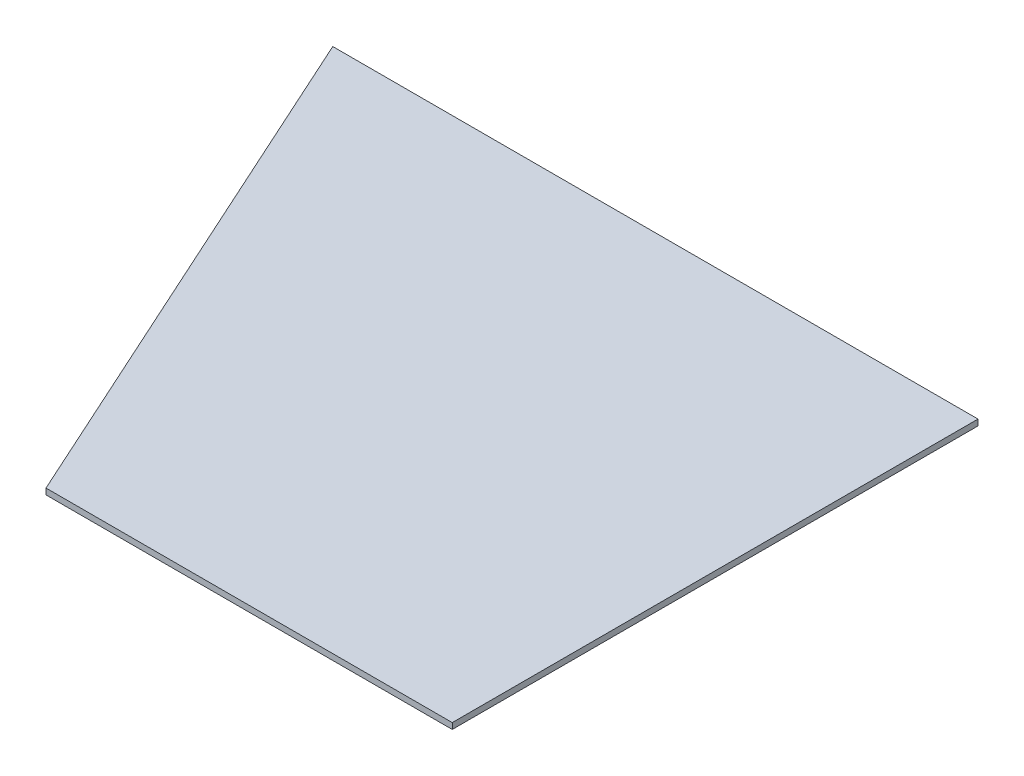
ISO-10303-21;
HEADER;
FILE_DESCRIPTION(('STEP AP214'),'2;1');
FILE_NAME('part.step','',(''),(''),'','','');
FILE_SCHEMA(('AUTOMOTIVE_DESIGN { 1 0 10303 214 1 1 1 1 }'));
ENDSEC;
DATA;
#1=APPLICATION_CONTEXT('core data for automotive mechanical design processes');
#2=APPLICATION_PROTOCOL_DEFINITION('international standard','automotive_design',2000,#1);
#3=PRODUCT_CONTEXT('',#1,'mechanical');
#4=PRODUCT('Part','Part','',(#3));
#5=PRODUCT_RELATED_PRODUCT_CATEGORY('part','',(#4));
#6=PRODUCT_DEFINITION_FORMATION('','',#4);
#7=PRODUCT_DEFINITION_CONTEXT('part definition',#1,'design');
#8=PRODUCT_DEFINITION('design','',#6,#7);
#9=PRODUCT_DEFINITION_SHAPE('','',#8);
#10=(LENGTH_UNIT() NAMED_UNIT(*) SI_UNIT(.MILLI.,.METRE.));
#11=(NAMED_UNIT(*) PLANE_ANGLE_UNIT() SI_UNIT($,.RADIAN.));
#12=(NAMED_UNIT(*) SI_UNIT($,.STERADIAN.) SOLID_ANGLE_UNIT());
#13=UNCERTAINTY_MEASURE_WITH_UNIT(LENGTH_MEASURE(1.E-05),#10,'distance_accuracy_value','');
#14=(GEOMETRIC_REPRESENTATION_CONTEXT(3) GLOBAL_UNCERTAINTY_ASSIGNED_CONTEXT((#13)) GLOBAL_UNIT_ASSIGNED_CONTEXT((#10,
#11,#12)) REPRESENTATION_CONTEXT('',''));
#15=CARTESIAN_POINT('',(0.,0.,0.));
#16=DIRECTION('',(0.,0.,1.));
#17=DIRECTION('',(1.,0.,0.));
#18=AXIS2_PLACEMENT_3D('',#15,#16,#17);
#19=CARTESIAN_POINT('',(580.,1.,176.));
#20=DIRECTION('',(0.910366477462605,0.,-0.413802944301184));
#21=DIRECTION('',(-0.413802944301184,0.,-0.910366477462605));
#22=AXIS2_PLACEMENT_3D('',#19,#20,#21);
#23=PLANE('',#22);
#24=DIRECTION('',(0.413802944301184,0.,0.910366477462605));
#25=VECTOR('',#24,1.);
#26=CARTESIAN_POINT('',(580.,-1.,176.));
#27=LINE('',#26,#25);
#28=CARTESIAN_POINT('',(500.,-1.,0.));
#29=VERTEX_POINT('',#28);
#30=CARTESIAN_POINT('',(580.,-1.,176.));
#31=VERTEX_POINT('',#30);
#32=EDGE_CURVE('E107',#29,#31,#27,.T.);
#33=ORIENTED_EDGE('',*,*,#32,.T.);
#34=DIRECTION('',(0.,-1.,0.));
#35=VECTOR('',#34,1.);
#36=CARTESIAN_POINT('',(580.,1.,176.));
#37=LINE('',#36,#35);
#38=CARTESIAN_POINT('',(580.,1.,176.));
#39=VERTEX_POINT('',#38);
#40=EDGE_CURVE('E11',#39,#31,#37,.T.);
#41=ORIENTED_EDGE('',*,*,#40,.F.);
#42=DIRECTION('',(0.413802944301184,0.,0.910366477462605));
#43=VECTOR('',#42,1.);
#44=CARTESIAN_POINT('',(580.,1.,176.));
#45=LINE('',#44,#43);
#46=CARTESIAN_POINT('',(500.,1.,0.));
#47=VERTEX_POINT('',#46);
#48=EDGE_CURVE('E91',#47,#39,#45,.T.);
#49=ORIENTED_EDGE('',*,*,#48,.F.);
#50=DIRECTION('',(0.,-1.,0.));
#51=VECTOR('',#50,1.);
#52=CARTESIAN_POINT('',(500.,1.,0.));
#53=LINE('',#52,#51);
#54=EDGE_CURVE('E103',#47,#29,#53,.T.);
#55=ORIENTED_EDGE('',*,*,#54,.T.);
#56=EDGE_LOOP('',(#33,#41,#49,#55));
#57=FACE_BOUND('',#56,.T.);
#58=ADVANCED_FACE('F39',(#57),#23,.F.);
#59=CARTESIAN_POINT('',(716.,1.,176.));
#60=DIRECTION('',(0.,0.,-1.));
#61=DIRECTION('',(-1.,0.,0.));
#62=AXIS2_PLACEMENT_3D('',#59,#60,#61);
#63=PLANE('',#62);
#64=DIRECTION('',(1.,0.,0.));
#65=VECTOR('',#64,1.);
#66=CARTESIAN_POINT('',(716.,-1.,176.));
#67=LINE('',#66,#65);
#68=CARTESIAN_POINT('',(716.,-1.,176.));
#69=VERTEX_POINT('',#68);
#70=EDGE_CURVE('E96',#31,#69,#67,.T.);
#71=ORIENTED_EDGE('',*,*,#70,.T.);
#72=DIRECTION('',(0.,-1.,0.));
#73=VECTOR('',#72,1.);
#74=CARTESIAN_POINT('',(716.,1.,176.));
#75=LINE('',#74,#73);
#76=CARTESIAN_POINT('',(716.,1.,176.));
#77=VERTEX_POINT('',#76);
#78=EDGE_CURVE('E48',#77,#69,#75,.T.);
#79=ORIENTED_EDGE('',*,*,#78,.F.);
#80=DIRECTION('',(1.,0.,0.));
#81=VECTOR('',#80,1.);
#82=CARTESIAN_POINT('',(716.,1.,176.));
#83=LINE('',#82,#81);
#84=EDGE_CURVE('E86',#39,#77,#83,.T.);
#85=ORIENTED_EDGE('',*,*,#84,.F.);
#86=ORIENTED_EDGE('',*,*,#40,.T.);
#87=EDGE_LOOP('',(#71,#79,#85,#86));
#88=FACE_BOUND('',#87,.T.);
#89=ADVANCED_FACE('F95',(#88),#63,.F.);
#90=CARTESIAN_POINT('',(716.,1.,0.));
#91=DIRECTION('',(-1.,0.,0.));
#92=DIRECTION('',(0.,0.,1.));
#93=AXIS2_PLACEMENT_3D('',#90,#91,#92);
#94=PLANE('',#93);
#95=DIRECTION('',(0.,0.,-1.));
#96=VECTOR('',#95,1.);
#97=CARTESIAN_POINT('',(716.,-1.,0.));
#98=LINE('',#97,#96);
#99=CARTESIAN_POINT('',(716.,-1.,0.));
#100=VERTEX_POINT('',#99);
#101=EDGE_CURVE('E73',#69,#100,#98,.T.);
#102=ORIENTED_EDGE('',*,*,#101,.T.);
#103=DIRECTION('',(0.,-1.,0.));
#104=VECTOR('',#103,1.);
#105=CARTESIAN_POINT('',(716.,1.,0.));
#106=LINE('',#105,#104);
#107=CARTESIAN_POINT('',(716.,1.,0.));
#108=VERTEX_POINT('',#107);
#109=EDGE_CURVE('E98',#108,#100,#106,.T.);
#110=ORIENTED_EDGE('',*,*,#109,.F.);
#111=DIRECTION('',(0.,0.,-1.));
#112=VECTOR('',#111,1.);
#113=CARTESIAN_POINT('',(716.,1.,0.));
#114=LINE('',#113,#112);
#115=EDGE_CURVE('E89',#77,#108,#114,.T.);
#116=ORIENTED_EDGE('',*,*,#115,.F.);
#117=ORIENTED_EDGE('',*,*,#78,.T.);
#118=EDGE_LOOP('',(#102,#110,#116,#117));
#119=FACE_BOUND('',#118,.T.);
#120=ADVANCED_FACE('F99',(#119),#94,.F.);
#121=CARTESIAN_POINT('',(500.,1.,0.));
#122=DIRECTION('',(0.,0.,1.));
#123=DIRECTION('',(1.,0.,0.));
#124=AXIS2_PLACEMENT_3D('',#121,#122,#123);
#125=PLANE('',#124);
#126=DIRECTION('',(-1.,0.,0.));
#127=VECTOR('',#126,1.);
#128=CARTESIAN_POINT('',(500.,-1.,0.));
#129=LINE('',#128,#127);
#130=EDGE_CURVE('E79',#100,#29,#129,.T.);
#131=ORIENTED_EDGE('',*,*,#130,.T.);
#132=ORIENTED_EDGE('',*,*,#54,.F.);
#133=DIRECTION('',(-1.,0.,0.));
#134=VECTOR('',#133,1.);
#135=CARTESIAN_POINT('',(500.,1.,0.));
#136=LINE('',#135,#134);
#137=EDGE_CURVE('E56',#108,#47,#136,.T.);
#138=ORIENTED_EDGE('',*,*,#137,.F.);
#139=ORIENTED_EDGE('',*,*,#109,.T.);
#140=EDGE_LOOP('',(#131,#132,#138,#139));
#141=FACE_BOUND('',#140,.T.);
#142=ADVANCED_FACE('F120',(#141),#125,.F.);
#143=CARTESIAN_POINT('',(0.,1.,0.));
#144=DIRECTION('',(0.,-1.,0.));
#145=DIRECTION('',(0.,0.,-1.));
#146=AXIS2_PLACEMENT_3D('',#143,#144,#145);
#147=PLANE('',#146);
#148=ORIENTED_EDGE('',*,*,#48,.T.);
#149=ORIENTED_EDGE('',*,*,#84,.T.);
#150=ORIENTED_EDGE('',*,*,#115,.T.);
#151=ORIENTED_EDGE('',*,*,#137,.T.);
#152=EDGE_LOOP('',(#148,#149,#150,#151));
#153=FACE_BOUND('',#152,.T.);
#154=ADVANCED_FACE('F87',(#153),#147,.F.);
#155=CARTESIAN_POINT('',(0.,-1.,0.));
#156=DIRECTION('',(0.,-1.,0.));
#157=DIRECTION('',(0.,0.,-1.));
#158=AXIS2_PLACEMENT_3D('',#155,#156,#157);
#159=PLANE('',#158);
#160=ORIENTED_EDGE('',*,*,#32,.F.);
#161=ORIENTED_EDGE('',*,*,#130,.F.);
#162=ORIENTED_EDGE('',*,*,#101,.F.);
#163=ORIENTED_EDGE('',*,*,#70,.F.);
#164=EDGE_LOOP('',(#160,#161,#162,#163));
#165=FACE_BOUND('',#164,.T.);
#166=ADVANCED_FACE('F123',(#165),#159,.T.);
#167=CLOSED_SHELL('',(#58,#89,#120,#142,#154,#166));
#168=MANIFOLD_SOLID_BREP('B2',#167);
#169=ADVANCED_BREP_SHAPE_REPRESENTATION('',(#18,#168),#14);
#170=SHAPE_DEFINITION_REPRESENTATION(#9,#169);
ENDSEC;
END-ISO-10303-21;
